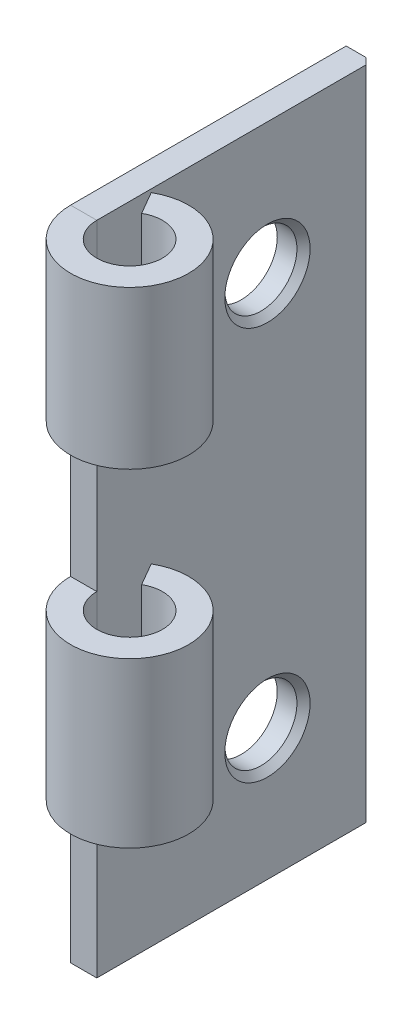
ISO-10303-21;
HEADER;
FILE_DESCRIPTION(('STEP AP214'),'2;1');
FILE_NAME('part.step','',(''),(''),'','','');
FILE_SCHEMA(('AUTOMOTIVE_DESIGN { 1 0 10303 214 1 1 1 1 }'));
ENDSEC;
DATA;
#1=APPLICATION_CONTEXT('core data for automotive mechanical design processes');
#2=APPLICATION_PROTOCOL_DEFINITION('international standard','automotive_design',2000,#1);
#3=PRODUCT_CONTEXT('',#1,'mechanical');
#4=PRODUCT('Part','Part','',(#3));
#5=PRODUCT_RELATED_PRODUCT_CATEGORY('part','',(#4));
#6=PRODUCT_DEFINITION_FORMATION('','',#4);
#7=PRODUCT_DEFINITION_CONTEXT('part definition',#1,'design');
#8=PRODUCT_DEFINITION('design','',#6,#7);
#9=PRODUCT_DEFINITION_SHAPE('','',#8);
#10=(LENGTH_UNIT() NAMED_UNIT(*) SI_UNIT(.MILLI.,.METRE.));
#11=(NAMED_UNIT(*) PLANE_ANGLE_UNIT() SI_UNIT($,.RADIAN.));
#12=(NAMED_UNIT(*) SI_UNIT($,.STERADIAN.) SOLID_ANGLE_UNIT());
#13=UNCERTAINTY_MEASURE_WITH_UNIT(LENGTH_MEASURE(1.E-05),#10,'distance_accuracy_value','');
#14=(GEOMETRIC_REPRESENTATION_CONTEXT(3) GLOBAL_UNCERTAINTY_ASSIGNED_CONTEXT((#13)) GLOBAL_UNIT_ASSIGNED_CONTEXT((#10,
#11,#12)) REPRESENTATION_CONTEXT('',''));
#15=CARTESIAN_POINT('',(0.,0.,0.));
#16=DIRECTION('',(0.,0.,1.));
#17=DIRECTION('',(1.,0.,0.));
#18=AXIS2_PLACEMENT_3D('',#15,#16,#17);
#19=CARTESIAN_POINT('',(2.,25.,10.5));
#20=DIRECTION('',(0.,0.,-1.));
#21=DIRECTION('',(0.,1.,0.));
#22=AXIS2_PLACEMENT_3D('',#19,#20,#21);
#23=PLANE('',#22);
#24=DIRECTION('',(-1.,0.,0.));
#25=VECTOR('',#24,1.);
#26=CARTESIAN_POINT('',(2.,0.499999999999997,10.5));
#27=LINE('',#26,#25);
#28=CARTESIAN_POINT('',(2.,0.499999999999997,10.5));
#29=VERTEX_POINT('',#28);
#30=CARTESIAN_POINT('',(0.,0.499999999999994,10.5));
#31=VERTEX_POINT('',#30);
#32=EDGE_CURVE('E130',#29,#31,#27,.T.);
#33=ORIENTED_EDGE('',*,*,#32,.F.);
#34=DIRECTION('',(0.,-1.,0.));
#35=VECTOR('',#34,1.);
#36=CARTESIAN_POINT('',(2.,25.,10.5));
#37=LINE('',#36,#35);
#38=CARTESIAN_POINT('',(2.,13.,10.5));
#39=VERTEX_POINT('',#38);
#40=EDGE_CURVE('E248',#39,#29,#37,.T.);
#41=ORIENTED_EDGE('',*,*,#40,.F.);
#42=DIRECTION('',(-1.,0.,0.));
#43=VECTOR('',#42,1.);
#44=CARTESIAN_POINT('',(2.,13.,10.5));
#45=LINE('',#44,#43);
#46=CARTESIAN_POINT('',(0.,13.,10.5));
#47=VERTEX_POINT('',#46);
#48=EDGE_CURVE('E166',#39,#47,#45,.T.);
#49=ORIENTED_EDGE('',*,*,#48,.T.);
#50=DIRECTION('',(0.,-1.,0.));
#51=VECTOR('',#50,1.);
#52=CARTESIAN_POINT('',(0.,25.,10.5));
#53=LINE('',#52,#51);
#54=EDGE_CURVE('E160',#47,#31,#53,.T.);
#55=ORIENTED_EDGE('',*,*,#54,.T.);
#56=EDGE_LOOP('',(#33,#41,#49,#55));
#57=FACE_BOUND('',#56,.T.);
#58=ADVANCED_FACE('F41',(#57),#23,.F.);
#59=CARTESIAN_POINT('',(2.,25.,-10.5));
#60=DIRECTION('',(0.,0.,1.));
#61=DIRECTION('',(0.,-1.,0.));
#62=AXIS2_PLACEMENT_3D('',#59,#60,#61);
#63=PLANE('',#62);
#64=DIRECTION('',(-1.,0.,0.));
#65=VECTOR('',#64,1.);
#66=CARTESIAN_POINT('',(2.,25.,-10.5));
#67=LINE('',#66,#65);
#68=CARTESIAN_POINT('',(1.5,25.,-10.5));
#69=VERTEX_POINT('',#68);
#70=CARTESIAN_POINT('',(0.,25.,-10.5));
#71=VERTEX_POINT('',#70);
#72=EDGE_CURVE('E186',#69,#71,#67,.T.);
#73=ORIENTED_EDGE('',*,*,#72,.F.);
#74=DIRECTION('',(0.,-1.,0.));
#75=VECTOR('',#74,1.);
#76=CARTESIAN_POINT('',(1.5,-25.,-10.5));
#77=LINE('',#76,#75);
#78=CARTESIAN_POINT('',(1.5,-25.,-10.5));
#79=VERTEX_POINT('',#78);
#80=EDGE_CURVE('E50',#69,#79,#77,.T.);
#81=ORIENTED_EDGE('',*,*,#80,.T.);
#82=DIRECTION('',(-1.,0.,0.));
#83=VECTOR('',#82,1.);
#84=CARTESIAN_POINT('',(2.,-25.,-10.5));
#85=LINE('',#84,#83);
#86=CARTESIAN_POINT('',(0.,-25.,-10.5));
#87=VERTEX_POINT('',#86);
#88=EDGE_CURVE('E178',#79,#87,#85,.T.);
#89=ORIENTED_EDGE('',*,*,#88,.T.);
#90=DIRECTION('',(0.,1.,0.));
#91=VECTOR('',#90,1.);
#92=CARTESIAN_POINT('',(0.,25.,-10.5));
#93=LINE('',#92,#91);
#94=EDGE_CURVE('E290',#87,#71,#93,.T.);
#95=ORIENTED_EDGE('',*,*,#94,.T.);
#96=EDGE_LOOP('',(#73,#81,#89,#95));
#97=FACE_BOUND('',#96,.T.);
#98=ADVANCED_FACE('F222',(#97),#63,.F.);
#99=CARTESIAN_POINT('',(2.,25.,10.5));
#100=DIRECTION('',(0.,-1.,0.));
#101=DIRECTION('',(0.,0.,-1.));
#102=AXIS2_PLACEMENT_3D('',#99,#100,#101);
#103=PLANE('',#102);
#104=DIRECTION('',(0.,0.,1.));
#105=VECTOR('',#104,1.);
#106=CARTESIAN_POINT('',(2.,25.,10.5));
#107=LINE('',#106,#105);
#108=CARTESIAN_POINT('',(2.,25.,-9.99999999999999));
#109=VERTEX_POINT('',#108);
#110=CARTESIAN_POINT('',(2.,25.,10.5));
#111=VERTEX_POINT('',#110);
#112=EDGE_CURVE('E177',#109,#111,#107,.T.);
#113=ORIENTED_EDGE('',*,*,#112,.F.);
#114=DIRECTION('',(-0.707106781186548,0.,-0.707106781186548));
#115=VECTOR('',#114,1.);
#116=CARTESIAN_POINT('',(2.,25.,-10.));
#117=LINE('',#116,#115);
#118=EDGE_CURVE('E64',#109,#69,#117,.T.);
#119=ORIENTED_EDGE('',*,*,#118,.T.);
#120=ORIENTED_EDGE('',*,*,#72,.T.);
#121=DIRECTION('',(0.,0.,1.));
#122=VECTOR('',#121,1.);
#123=CARTESIAN_POINT('',(0.,25.,10.5));
#124=LINE('',#123,#122);
#125=CARTESIAN_POINT('',(0.,25.,10.5));
#126=VERTEX_POINT('',#125);
#127=EDGE_CURVE('E171',#71,#126,#124,.T.);
#128=ORIENTED_EDGE('',*,*,#127,.T.);
#129=DIRECTION('',(-1.,0.,0.));
#130=VECTOR('',#129,1.);
#131=CARTESIAN_POINT('',(2.,25.,10.5));
#132=LINE('',#131,#130);
#133=EDGE_CURVE('E184',#111,#126,#132,.T.);
#134=ORIENTED_EDGE('',*,*,#133,.F.);
#135=EDGE_LOOP('',(#113,#119,#120,#128,#134));
#136=FACE_BOUND('',#135,.T.);
#137=ADVANCED_FACE('F228',(#136),#103,.F.);
#138=CARTESIAN_POINT('',(2.,-12.,10.5));
#139=VERTEX_POINT('',#138);
#140=CARTESIAN_POINT('',(2.,-25.,10.5));
#141=VERTEX_POINT('',#140);
#142=EDGE_CURVE('E243',#139,#141,#37,.T.);
#143=ORIENTED_EDGE('',*,*,#142,.F.);
#144=DIRECTION('',(-1.,0.,0.));
#145=VECTOR('',#144,1.);
#146=CARTESIAN_POINT('',(2.,-12.,10.5));
#147=LINE('',#146,#145);
#148=CARTESIAN_POINT('',(0.,-12.,10.5));
#149=VERTEX_POINT('',#148);
#150=EDGE_CURVE('E141',#139,#149,#147,.T.);
#151=ORIENTED_EDGE('',*,*,#150,.T.);
#152=CARTESIAN_POINT('',(0.,-25.,10.5));
#153=VERTEX_POINT('',#152);
#154=EDGE_CURVE('E162',#149,#153,#53,.T.);
#155=ORIENTED_EDGE('',*,*,#154,.T.);
#156=DIRECTION('',(-1.,0.,0.));
#157=VECTOR('',#156,1.);
#158=CARTESIAN_POINT('',(2.,-25.,10.5));
#159=LINE('',#158,#157);
#160=EDGE_CURVE('E180',#141,#153,#159,.T.);
#161=ORIENTED_EDGE('',*,*,#160,.F.);
#162=EDGE_LOOP('',(#143,#151,#155,#161));
#163=FACE_BOUND('',#162,.T.);
#164=ADVANCED_FACE('F224',(#163),#23,.F.);
#165=CARTESIAN_POINT('',(2.,-25.,10.5));
#166=DIRECTION('',(0.,1.,0.));
#167=DIRECTION('',(0.,0.,1.));
#168=AXIS2_PLACEMENT_3D('',#165,#166,#167);
#169=PLANE('',#168);
#170=ORIENTED_EDGE('',*,*,#88,.F.);
#171=DIRECTION('',(0.707106781186548,0.,0.707106781186548));
#172=VECTOR('',#171,1.);
#173=CARTESIAN_POINT('',(2.,-25.,-10.));
#174=LINE('',#173,#172);
#175=CARTESIAN_POINT('',(2.,-25.,-10.));
#176=VERTEX_POINT('',#175);
#177=EDGE_CURVE('E11',#79,#176,#174,.T.);
#178=ORIENTED_EDGE('',*,*,#177,.T.);
#179=DIRECTION('',(0.,0.,-1.));
#180=VECTOR('',#179,1.);
#181=CARTESIAN_POINT('',(2.,-25.,10.5));
#182=LINE('',#181,#180);
#183=EDGE_CURVE('E181',#141,#176,#182,.T.);
#184=ORIENTED_EDGE('',*,*,#183,.F.);
#185=ORIENTED_EDGE('',*,*,#160,.T.);
#186=DIRECTION('',(0.,0.,-1.));
#187=VECTOR('',#186,1.);
#188=CARTESIAN_POINT('',(0.,-25.,10.5));
#189=LINE('',#188,#187);
#190=EDGE_CURVE('E170',#153,#87,#189,.T.);
#191=ORIENTED_EDGE('',*,*,#190,.T.);
#192=EDGE_LOOP('',(#170,#178,#184,#185,#191));
#193=FACE_BOUND('',#192,.T.);
#194=ADVANCED_FACE('F233',(#193),#169,.F.);
#195=CARTESIAN_POINT('',(2.,0.,0.));
#196=DIRECTION('',(1.,0.,0.));
#197=DIRECTION('',(0.,0.,-1.));
#198=AXIS2_PLACEMENT_3D('',#195,#196,#197);
#199=PLANE('',#198);
#200=CARTESIAN_POINT('',(2.,-15.,-2.5));
#201=DIRECTION('',(1.,0.,0.));
#202=DIRECTION('',(0.,0.,-1.));
#203=AXIS2_PLACEMENT_3D('',#200,#201,#202);
#204=CIRCLE('',#203,3.24999999999999);
#205=CARTESIAN_POINT('',(2.,-15.,-5.74999999999999));
#206=VERTEX_POINT('',#205);
#207=EDGE_CURVE('E197',#206,#206,#204,.F.);
#208=ORIENTED_EDGE('',*,*,#207,.T.);
#209=EDGE_LOOP('',(#208));
#210=FACE_BOUND('',#209,.T.);
#211=CARTESIAN_POINT('',(2.,15.,-2.5));
#212=DIRECTION('',(1.,0.,0.));
#213=DIRECTION('',(0.,0.,-1.));
#214=AXIS2_PLACEMENT_3D('',#211,#212,#213);
#215=CIRCLE('',#214,3.24999999999999);
#216=CARTESIAN_POINT('',(2.,15.,-5.74999999999999));
#217=VERTEX_POINT('',#216);
#218=EDGE_CURVE('E194',#217,#217,#215,.F.);
#219=ORIENTED_EDGE('',*,*,#218,.T.);
#220=EDGE_LOOP('',(#219));
#221=FACE_BOUND('',#220,.T.);
#222=ORIENTED_EDGE('',*,*,#183,.T.);
#223=DIRECTION('',(0.,1.,0.));
#224=VECTOR('',#223,1.);
#225=CARTESIAN_POINT('',(2.,25.,-10.));
#226=LINE('',#225,#224);
#227=EDGE_CURVE('E191',#176,#109,#226,.T.);
#228=ORIENTED_EDGE('',*,*,#227,.T.);
#229=ORIENTED_EDGE('',*,*,#112,.T.);
#230=EDGE_CURVE('E250',#111,#39,#37,.T.);
#231=ORIENTED_EDGE('',*,*,#230,.T.);
#232=ORIENTED_EDGE('',*,*,#40,.T.);
#233=DIRECTION('',(0.,-1.,0.));
#234=VECTOR('',#233,1.);
#235=CARTESIAN_POINT('',(2.,-12.,10.5));
#236=LINE('',#235,#234);
#237=EDGE_CURVE('E251',#139,#29,#236,.F.);
#238=ORIENTED_EDGE('',*,*,#237,.F.);
#239=ORIENTED_EDGE('',*,*,#142,.T.);
#240=EDGE_LOOP('',(#222,#228,#229,#231,#232,#238,#239));
#241=FACE_BOUND('',#240,.T.);
#242=ADVANCED_FACE('F239',(#210,#221,#241),#199,.T.);
#243=CARTESIAN_POINT('',(0.,0.,0.));
#244=DIRECTION('',(1.,0.,0.));
#245=DIRECTION('',(0.,0.,-1.));
#246=AXIS2_PLACEMENT_3D('',#243,#244,#245);
#247=PLANE('',#246);
#248=CARTESIAN_POINT('',(0.,15.,-2.5));
#249=DIRECTION('',(1.,0.,0.));
#250=DIRECTION('',(0.,0.,-1.));
#251=AXIS2_PLACEMENT_3D('',#248,#249,#250);
#252=CIRCLE('',#251,2.75);
#253=CARTESIAN_POINT('',(0.,15.,-5.25));
#254=VERTEX_POINT('',#253);
#255=EDGE_CURVE('E346',#254,#254,#252,.T.);
#256=ORIENTED_EDGE('',*,*,#255,.T.);
#257=EDGE_LOOP('',(#256));
#258=FACE_BOUND('',#257,.T.);
#259=CARTESIAN_POINT('',(0.,-15.,-2.5));
#260=DIRECTION('',(1.,0.,0.));
#261=DIRECTION('',(0.,0.,-1.));
#262=AXIS2_PLACEMENT_3D('',#259,#260,#261);
#263=CIRCLE('',#262,2.74999999999999);
#264=CARTESIAN_POINT('',(0.,-15.,-5.24999999999999));
#265=VERTEX_POINT('',#264);
#266=EDGE_CURVE('E263',#265,#265,#263,.T.);
#267=ORIENTED_EDGE('',*,*,#266,.T.);
#268=EDGE_LOOP('',(#267));
#269=FACE_BOUND('',#268,.T.);
#270=ORIENTED_EDGE('',*,*,#94,.F.);
#271=ORIENTED_EDGE('',*,*,#190,.F.);
#272=ORIENTED_EDGE('',*,*,#154,.F.);
#273=DIRECTION('',(0.,-1.,0.));
#274=VECTOR('',#273,1.);
#275=CARTESIAN_POINT('',(0.,-12.,10.5));
#276=LINE('',#275,#274);
#277=EDGE_CURVE('E149',#149,#31,#276,.F.);
#278=ORIENTED_EDGE('',*,*,#277,.T.);
#279=ORIENTED_EDGE('',*,*,#54,.F.);
#280=EDGE_CURVE('E167',#126,#47,#53,.T.);
#281=ORIENTED_EDGE('',*,*,#280,.F.);
#282=ORIENTED_EDGE('',*,*,#127,.F.);
#283=EDGE_LOOP('',(#270,#271,#272,#278,#279,#281,#282));
#284=FACE_BOUND('',#283,.T.);
#285=ADVANCED_FACE('F158',(#258,#269,#284),#247,.F.);
#286=CARTESIAN_POINT('',(3.24999999999998,19.,8.33493649053892));
#287=DIRECTION('',(0.866025403784433,0.,-0.50000000000001));
#288=DIRECTION('',(0.,-1.,0.));
#289=AXIS2_PLACEMENT_3D('',#286,#287,#288);
#290=PLANE('',#289);
#291=DIRECTION('',(-0.50000000000001,0.,-0.866025403784433));
#292=VECTOR('',#291,1.);
#293=CARTESIAN_POINT('',(3.24999999999998,13.,8.33493649053892));
#294=LINE('',#293,#292);
#295=CARTESIAN_POINT('',(3.24999999999998,13.,8.33493649053892));
#296=VERTEX_POINT('',#295);
#297=CARTESIAN_POINT('',(2.24999999999995,13.,6.60288568297005));
#298=VERTEX_POINT('',#297);
#299=EDGE_CURVE('E288',#296,#298,#294,.T.);
#300=ORIENTED_EDGE('',*,*,#299,.F.);
#301=DIRECTION('',(0.,-1.,0.));
#302=VECTOR('',#301,1.);
#303=CARTESIAN_POINT('',(3.24999999999998,13.,8.33493649053892));
#304=LINE('',#303,#302);
#305=CARTESIAN_POINT('',(3.24999999999998,25.,8.33493649053892));
#306=VERTEX_POINT('',#305);
#307=EDGE_CURVE('E268',#306,#296,#304,.T.);
#308=ORIENTED_EDGE('',*,*,#307,.F.);
#309=DIRECTION('',(-0.50000000000001,0.,-0.866025403784433));
#310=VECTOR('',#309,1.);
#311=CARTESIAN_POINT('',(3.24999999999998,25.,8.33493649053892));
#312=LINE('',#311,#310);
#313=CARTESIAN_POINT('',(2.24999999999995,25.,6.60288568297005));
#314=VERTEX_POINT('',#313);
#315=EDGE_CURVE('E286',#306,#314,#312,.T.);
#316=ORIENTED_EDGE('',*,*,#315,.T.);
#317=DIRECTION('',(0.,-1.,0.));
#318=VECTOR('',#317,1.);
#319=CARTESIAN_POINT('',(2.24999999999995,13.,6.60288568297005));
#320=LINE('',#319,#318);
#321=EDGE_CURVE('E274',#314,#298,#320,.T.);
#322=ORIENTED_EDGE('',*,*,#321,.T.);
#323=EDGE_LOOP('',(#300,#308,#316,#322));
#324=FACE_BOUND('',#323,.T.);
#325=ADVANCED_FACE('F315',(#324),#290,.F.);
#326=CARTESIAN_POINT('',(4.5,25.,10.5));
#327=DIRECTION('',(0.,1.,0.));
#328=DIRECTION('',(0.,0.,1.));
#329=AXIS2_PLACEMENT_3D('',#326,#327,#328);
#330=PLANE('',#329);
#331=ORIENTED_EDGE('',*,*,#315,.F.);
#332=CARTESIAN_POINT('',(4.5,25.,10.5));
#333=DIRECTION('',(0.,-1.,0.));
#334=DIRECTION('',(0.,0.,-1.));
#335=AXIS2_PLACEMENT_3D('',#332,#333,#334);
#336=CIRCLE('',#335,2.5);
#337=EDGE_CURVE('E277',#111,#306,#336,.F.);
#338=ORIENTED_EDGE('',*,*,#337,.F.);
#339=ORIENTED_EDGE('',*,*,#133,.T.);
#340=CARTESIAN_POINT('',(4.5,25.,10.5));
#341=DIRECTION('',(0.,-1.,0.));
#342=DIRECTION('',(0.,0.,-1.));
#343=AXIS2_PLACEMENT_3D('',#340,#341,#342);
#344=CIRCLE('',#343,4.5);
#345=EDGE_CURVE('E270',#126,#314,#344,.F.);
#346=ORIENTED_EDGE('',*,*,#345,.T.);
#347=EDGE_LOOP('',(#331,#338,#339,#346));
#348=FACE_BOUND('',#347,.T.);
#349=ADVANCED_FACE('F303',(#348),#330,.T.);
#350=CARTESIAN_POINT('',(4.5,13.,10.5));
#351=DIRECTION('',(0.,1.,0.));
#352=DIRECTION('',(0.,0.,1.));
#353=AXIS2_PLACEMENT_3D('',#350,#351,#352);
#354=PLANE('',#353);
#355=CARTESIAN_POINT('',(4.5,13.,10.5));
#356=DIRECTION('',(0.,-1.,0.));
#357=DIRECTION('',(0.,0.,-1.));
#358=AXIS2_PLACEMENT_3D('',#355,#356,#357);
#359=CIRCLE('',#358,2.5);
#360=EDGE_CURVE('E281',#296,#39,#359,.T.);
#361=ORIENTED_EDGE('',*,*,#360,.F.);
#362=ORIENTED_EDGE('',*,*,#299,.T.);
#363=CARTESIAN_POINT('',(4.5,13.,10.5));
#364=DIRECTION('',(0.,-1.,0.));
#365=DIRECTION('',(0.,0.,-1.));
#366=AXIS2_PLACEMENT_3D('',#363,#364,#365);
#367=CIRCLE('',#366,4.5);
#368=EDGE_CURVE('E273',#298,#47,#367,.T.);
#369=ORIENTED_EDGE('',*,*,#368,.T.);
#370=ORIENTED_EDGE('',*,*,#48,.F.);
#371=EDGE_LOOP('',(#361,#362,#369,#370));
#372=FACE_BOUND('',#371,.T.);
#373=ADVANCED_FACE('F313',(#372),#354,.F.);
#374=CARTESIAN_POINT('',(4.5,13.,10.5));
#375=DIRECTION('',(0.,-1.,0.));
#376=DIRECTION('',(-0.50000000000001,0.,-0.866025403784433));
#377=AXIS2_PLACEMENT_3D('',#374,#375,#376);
#378=CYLINDRICAL_SURFACE('',#377,4.5);
#379=ORIENTED_EDGE('',*,*,#280,.T.);
#380=ORIENTED_EDGE('',*,*,#368,.F.);
#381=ORIENTED_EDGE('',*,*,#321,.F.);
#382=ORIENTED_EDGE('',*,*,#345,.F.);
#383=EDGE_LOOP('',(#379,#380,#381,#382));
#384=FACE_BOUND('',#383,.T.);
#385=ADVANCED_FACE('F300',(#384),#378,.T.);
#386=CARTESIAN_POINT('',(4.5,13.,10.5));
#387=DIRECTION('',(0.,-1.,0.));
#388=DIRECTION('',(-0.50000000000001,0.,-0.866025403784433));
#389=AXIS2_PLACEMENT_3D('',#386,#387,#388);
#390=CYLINDRICAL_SURFACE('',#389,2.5);
#391=ORIENTED_EDGE('',*,*,#230,.F.);
#392=ORIENTED_EDGE('',*,*,#337,.T.);
#393=ORIENTED_EDGE('',*,*,#307,.T.);
#394=ORIENTED_EDGE('',*,*,#360,.T.);
#395=EDGE_LOOP('',(#391,#392,#393,#394));
#396=FACE_BOUND('',#395,.T.);
#397=ADVANCED_FACE('F308',(#396),#390,.F.);
#398=CARTESIAN_POINT('',(3.24999999999998,-5.75,8.33493649053891));
#399=DIRECTION('',(0.866025403784433,0.,-0.50000000000001));
#400=DIRECTION('',(0.,-1.,0.));
#401=AXIS2_PLACEMENT_3D('',#398,#399,#400);
#402=PLANE('',#401);
#403=DIRECTION('',(-0.50000000000001,0.,-0.866025403784433));
#404=VECTOR('',#403,1.);
#405=CARTESIAN_POINT('',(3.24999999999998,-12.,8.33493649053891));
#406=LINE('',#405,#404);
#407=CARTESIAN_POINT('',(3.24999999999998,-12.,8.33493649053891));
#408=VERTEX_POINT('',#407);
#409=CARTESIAN_POINT('',(2.24999999999996,-12.,6.60288568297005));
#410=VERTEX_POINT('',#409);
#411=EDGE_CURVE('E266',#408,#410,#406,.T.);
#412=ORIENTED_EDGE('',*,*,#411,.F.);
#413=DIRECTION('',(0.,-1.,0.));
#414=VECTOR('',#413,1.);
#415=CARTESIAN_POINT('',(3.24999999999998,-12.,8.33493649053891));
#416=LINE('',#415,#414);
#417=CARTESIAN_POINT('',(3.24999999999998,0.499999999999997,8.33493649053891));
#418=VERTEX_POINT('',#417);
#419=EDGE_CURVE('E258',#418,#408,#416,.T.);
#420=ORIENTED_EDGE('',*,*,#419,.F.);
#421=DIRECTION('',(-0.50000000000001,0.,-0.866025403784433));
#422=VECTOR('',#421,1.);
#423=CARTESIAN_POINT('',(3.24999999999998,0.499999999999997,8.33493649053891));
#424=LINE('',#423,#422);
#425=CARTESIAN_POINT('',(2.24999999999996,0.499999999999994,6.60288568297005));
#426=VERTEX_POINT('',#425);
#427=EDGE_CURVE('E140',#418,#426,#424,.T.);
#428=ORIENTED_EDGE('',*,*,#427,.T.);
#429=DIRECTION('',(0.,-1.,0.));
#430=VECTOR('',#429,1.);
#431=CARTESIAN_POINT('',(2.24999999999996,-12.,6.60288568297005));
#432=LINE('',#431,#430);
#433=EDGE_CURVE('E152',#426,#410,#432,.T.);
#434=ORIENTED_EDGE('',*,*,#433,.T.);
#435=EDGE_LOOP('',(#412,#420,#428,#434));
#436=FACE_BOUND('',#435,.T.);
#437=ADVANCED_FACE('F355',(#436),#402,.F.);
#438=CARTESIAN_POINT('',(4.5,0.499999999999997,10.5));
#439=DIRECTION('',(0.,1.,0.));
#440=DIRECTION('',(0.,0.,1.));
#441=AXIS2_PLACEMENT_3D('',#438,#439,#440);
#442=PLANE('',#441);
#443=ORIENTED_EDGE('',*,*,#427,.F.);
#444=CARTESIAN_POINT('',(4.5,0.499999999999997,10.5));
#445=DIRECTION('',(0.,-1.,0.));
#446=DIRECTION('',(0.,0.,-1.));
#447=AXIS2_PLACEMENT_3D('',#444,#445,#446);
#448=CIRCLE('',#447,2.5);
#449=EDGE_CURVE('E135',#29,#418,#448,.F.);
#450=ORIENTED_EDGE('',*,*,#449,.F.);
#451=ORIENTED_EDGE('',*,*,#32,.T.);
#452=CARTESIAN_POINT('',(4.5,0.499999999999994,10.5));
#453=DIRECTION('',(0.,-1.,0.));
#454=DIRECTION('',(0.,0.,-1.));
#455=AXIS2_PLACEMENT_3D('',#452,#453,#454);
#456=CIRCLE('',#455,4.5);
#457=EDGE_CURVE('E133',#31,#426,#456,.F.);
#458=ORIENTED_EDGE('',*,*,#457,.T.);
#459=EDGE_LOOP('',(#443,#450,#451,#458));
#460=FACE_BOUND('',#459,.T.);
#461=ADVANCED_FACE('F132',(#460),#442,.T.);
#462=CARTESIAN_POINT('',(4.5,-12.,10.5));
#463=DIRECTION('',(0.,1.,0.));
#464=DIRECTION('',(0.,0.,1.));
#465=AXIS2_PLACEMENT_3D('',#462,#463,#464);
#466=PLANE('',#465);
#467=CARTESIAN_POINT('',(4.5,-12.,10.5));
#468=DIRECTION('',(0.,-1.,0.));
#469=DIRECTION('',(0.,0.,-1.));
#470=AXIS2_PLACEMENT_3D('',#467,#468,#469);
#471=CIRCLE('',#470,2.5);
#472=EDGE_CURVE('E255',#408,#139,#471,.T.);
#473=ORIENTED_EDGE('',*,*,#472,.F.);
#474=ORIENTED_EDGE('',*,*,#411,.T.);
#475=CARTESIAN_POINT('',(4.5,-12.,10.5));
#476=DIRECTION('',(0.,-1.,0.));
#477=DIRECTION('',(0.,0.,-1.));
#478=AXIS2_PLACEMENT_3D('',#475,#476,#477);
#479=CIRCLE('',#478,4.5);
#480=EDGE_CURVE('E163',#410,#149,#479,.T.);
#481=ORIENTED_EDGE('',*,*,#480,.T.);
#482=ORIENTED_EDGE('',*,*,#150,.F.);
#483=EDGE_LOOP('',(#473,#474,#481,#482));
#484=FACE_BOUND('',#483,.T.);
#485=ADVANCED_FACE('F353',(#484),#466,.F.);
#486=CARTESIAN_POINT('',(4.5,-12.,10.5));
#487=DIRECTION('',(0.,-1.,0.));
#488=DIRECTION('',(-0.50000000000001,0.,-0.866025403784433));
#489=AXIS2_PLACEMENT_3D('',#486,#487,#488);
#490=CYLINDRICAL_SURFACE('',#489,4.5);
#491=ORIENTED_EDGE('',*,*,#277,.F.);
#492=ORIENTED_EDGE('',*,*,#480,.F.);
#493=ORIENTED_EDGE('',*,*,#433,.F.);
#494=ORIENTED_EDGE('',*,*,#457,.F.);
#495=EDGE_LOOP('',(#491,#492,#493,#494));
#496=FACE_BOUND('',#495,.T.);
#497=ADVANCED_FACE('F147',(#496),#490,.T.);
#498=CARTESIAN_POINT('',(4.5,-12.,10.5));
#499=DIRECTION('',(0.,-1.,0.));
#500=DIRECTION('',(-0.50000000000001,0.,-0.866025403784433));
#501=AXIS2_PLACEMENT_3D('',#498,#499,#500);
#502=CYLINDRICAL_SURFACE('',#501,2.5);
#503=ORIENTED_EDGE('',*,*,#237,.T.);
#504=ORIENTED_EDGE('',*,*,#449,.T.);
#505=ORIENTED_EDGE('',*,*,#419,.T.);
#506=ORIENTED_EDGE('',*,*,#472,.T.);
#507=EDGE_LOOP('',(#503,#504,#505,#506));
#508=FACE_BOUND('',#507,.T.);
#509=ADVANCED_FACE('F341',(#508),#502,.F.);
#510=CARTESIAN_POINT('',(2.,-15.,-2.5));
#511=DIRECTION('',(1.,0.,0.));
#512=DIRECTION('',(0.,0.,-1.));
#513=AXIS2_PLACEMENT_3D('',#510,#511,#512);
#514=CYLINDRICAL_SURFACE('',#513,2.74999999999999);
#515=CARTESIAN_POINT('',(1.5,-15.,-2.5));
#516=DIRECTION('',(1.,0.,0.));
#517=DIRECTION('',(0.,0.,-1.));
#518=AXIS2_PLACEMENT_3D('',#515,#516,#517);
#519=CIRCLE('',#518,2.74999999999999);
#520=CARTESIAN_POINT('',(1.5,-15.,-5.24999999999999));
#521=VERTEX_POINT('',#520);
#522=EDGE_CURVE('E188',#521,#521,#519,.T.);
#523=ORIENTED_EDGE('',*,*,#522,.T.);
#524=EDGE_LOOP('',(#523));
#525=FACE_BOUND('',#524,.T.);
#526=ORIENTED_EDGE('',*,*,#266,.F.);
#527=EDGE_LOOP('',(#526));
#528=FACE_BOUND('',#527,.T.);
#529=ADVANCED_FACE('F338',(#525,#528),#514,.F.);
#530=CARTESIAN_POINT('',(2.,15.,-2.5));
#531=DIRECTION('',(1.,0.,0.));
#532=DIRECTION('',(0.,0.,-1.));
#533=AXIS2_PLACEMENT_3D('',#530,#531,#532);
#534=CYLINDRICAL_SURFACE('',#533,2.75);
#535=CARTESIAN_POINT('',(1.5,15.,-2.5));
#536=DIRECTION('',(1.,0.,0.));
#537=DIRECTION('',(0.,0.,-1.));
#538=AXIS2_PLACEMENT_3D('',#535,#536,#537);
#539=CIRCLE('',#538,2.75);
#540=CARTESIAN_POINT('',(1.5,15.,-5.25));
#541=VERTEX_POINT('',#540);
#542=EDGE_CURVE('E200',#541,#541,#539,.T.);
#543=ORIENTED_EDGE('',*,*,#542,.T.);
#544=EDGE_LOOP('',(#543));
#545=FACE_BOUND('',#544,.T.);
#546=ORIENTED_EDGE('',*,*,#255,.F.);
#547=EDGE_LOOP('',(#546));
#548=FACE_BOUND('',#547,.T.);
#549=ADVANCED_FACE('F205',(#545,#548),#534,.F.);
#550=CARTESIAN_POINT('',(1.5,-15.,-2.5));
#551=DIRECTION('',(1.,0.,0.));
#552=DIRECTION('',(0.,0.,-1.));
#553=AXIS2_PLACEMENT_3D('',#550,#551,#552);
#554=CONICAL_SURFACE('',#553,2.74999999999999,0.785398163397446);
#555=ORIENTED_EDGE('',*,*,#207,.F.);
#556=EDGE_LOOP('',(#555));
#557=FACE_BOUND('',#556,.T.);
#558=ORIENTED_EDGE('',*,*,#522,.F.);
#559=EDGE_LOOP('',(#558));
#560=FACE_BOUND('',#559,.T.);
#561=ADVANCED_FACE('F210',(#557,#560),#554,.F.);
#562=CARTESIAN_POINT('',(1.5,15.,-2.5));
#563=DIRECTION('',(1.,0.,0.));
#564=DIRECTION('',(0.,0.,-1.));
#565=AXIS2_PLACEMENT_3D('',#562,#563,#564);
#566=CONICAL_SURFACE('',#565,2.75,0.785398163397446);
#567=ORIENTED_EDGE('',*,*,#218,.F.);
#568=EDGE_LOOP('',(#567));
#569=FACE_BOUND('',#568,.T.);
#570=ORIENTED_EDGE('',*,*,#542,.F.);
#571=EDGE_LOOP('',(#570));
#572=FACE_BOUND('',#571,.T.);
#573=ADVANCED_FACE('F208',(#569,#572),#566,.F.);
#574=CARTESIAN_POINT('',(2.,0.,-10.));
#575=DIRECTION('',(0.707106781186547,0.,-0.707106781186547));
#576=DIRECTION('',(0.,-1.,0.));
#577=AXIS2_PLACEMENT_3D('',#574,#575,#576);
#578=PLANE('',#577);
#579=ORIENTED_EDGE('',*,*,#177,.F.);
#580=ORIENTED_EDGE('',*,*,#80,.F.);
#581=ORIENTED_EDGE('',*,*,#118,.F.);
#582=ORIENTED_EDGE('',*,*,#227,.F.);
#583=EDGE_LOOP('',(#579,#580,#581,#582));
#584=FACE_BOUND('',#583,.T.);
#585=ADVANCED_FACE('F44',(#584),#578,.T.);
#586=CLOSED_SHELL('',(#58,#98,#137,#164,#194,#242,#285,#325,#349,#373,#385,#397,#437,#461,#485,
#497,#509,#529,#549,#561,#573,#585));
#587=MANIFOLD_SOLID_BREP('B2',#586);
#588=ADVANCED_BREP_SHAPE_REPRESENTATION('',(#18,#587),#14);
#589=SHAPE_DEFINITION_REPRESENTATION(#9,#588);
ENDSEC;
END-ISO-10303-21;
